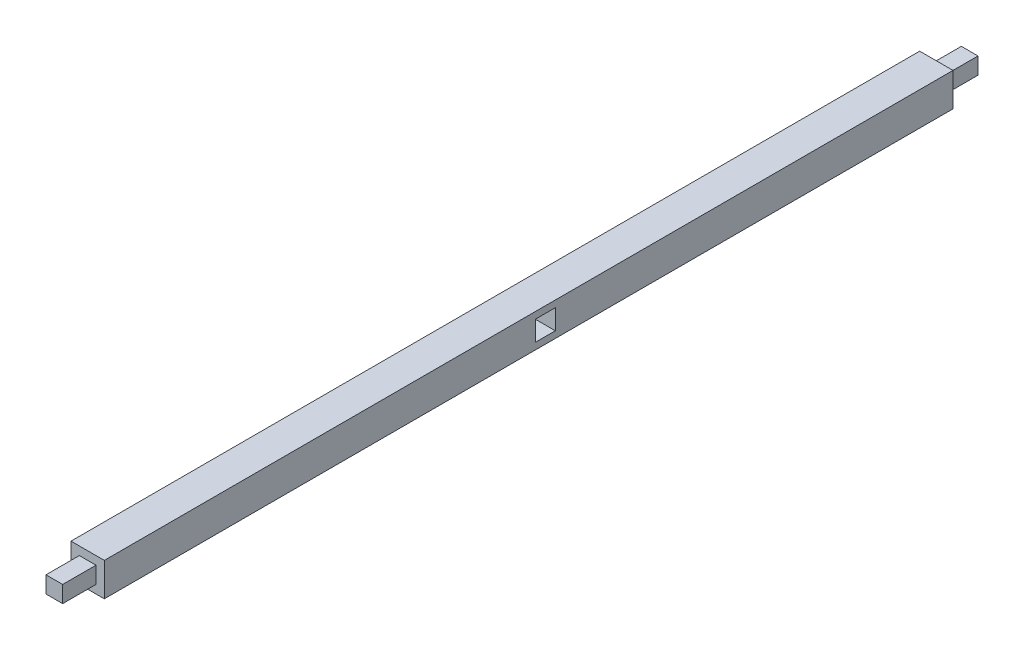
ISO-10303-21;
HEADER;
FILE_DESCRIPTION(('STEP AP214'),'2;1');
FILE_NAME('part.step','',(''),(''),'','','');
FILE_SCHEMA(('AUTOMOTIVE_DESIGN { 1 0 10303 214 1 1 1 1 }'));
ENDSEC;
DATA;
#1=APPLICATION_CONTEXT('core data for automotive mechanical design processes');
#2=APPLICATION_PROTOCOL_DEFINITION('international standard','automotive_design',2000,#1);
#3=PRODUCT_CONTEXT('',#1,'mechanical');
#4=PRODUCT('Part','Part','',(#3));
#5=PRODUCT_RELATED_PRODUCT_CATEGORY('part','',(#4));
#6=PRODUCT_DEFINITION_FORMATION('','',#4);
#7=PRODUCT_DEFINITION_CONTEXT('part definition',#1,'design');
#8=PRODUCT_DEFINITION('design','',#6,#7);
#9=PRODUCT_DEFINITION_SHAPE('','',#8);
#10=(LENGTH_UNIT() NAMED_UNIT(*) SI_UNIT(.MILLI.,.METRE.));
#11=(NAMED_UNIT(*) PLANE_ANGLE_UNIT() SI_UNIT($,.RADIAN.));
#12=(NAMED_UNIT(*) SI_UNIT($,.STERADIAN.) SOLID_ANGLE_UNIT());
#13=UNCERTAINTY_MEASURE_WITH_UNIT(LENGTH_MEASURE(1.E-05),#10,'distance_accuracy_value','');
#14=(GEOMETRIC_REPRESENTATION_CONTEXT(3) GLOBAL_UNCERTAINTY_ASSIGNED_CONTEXT((#13)) GLOBAL_UNIT_ASSIGNED_CONTEXT((#10,
#11,#12)) REPRESENTATION_CONTEXT('',''));
#15=CARTESIAN_POINT('',(0.,0.,0.));
#16=DIRECTION('',(0.,0.,1.));
#17=DIRECTION('',(1.,0.,0.));
#18=AXIS2_PLACEMENT_3D('',#15,#16,#17);
#19=CARTESIAN_POINT('',(0.,0.,127.3));
#20=DIRECTION('',(0.,0.,-1.));
#21=DIRECTION('',(-1.,0.,0.));
#22=AXIS2_PLACEMENT_3D('',#19,#20,#21);
#23=PLANE('',#22);
#24=DIRECTION('',(0.,-1.,0.));
#25=VECTOR('',#24,1.);
#26=CARTESIAN_POINT('',(0.,0.,127.3));
#27=LINE('',#26,#25);
#28=CARTESIAN_POINT('',(0.,5.,127.3));
#29=VERTEX_POINT('',#28);
#30=CARTESIAN_POINT('',(0.,0.,127.3));
#31=VERTEX_POINT('',#30);
#32=EDGE_CURVE('E240',#29,#31,#27,.T.);
#33=ORIENTED_EDGE('',*,*,#32,.T.);
#34=DIRECTION('',(1.,0.,0.));
#35=VECTOR('',#34,1.);
#36=CARTESIAN_POINT('',(0.,0.,127.3));
#37=LINE('',#36,#35);
#38=CARTESIAN_POINT('',(5.,0.,127.3));
#39=VERTEX_POINT('',#38);
#40=EDGE_CURVE('E243',#31,#39,#37,.T.);
#41=ORIENTED_EDGE('',*,*,#40,.T.);
#42=DIRECTION('',(0.,1.,0.));
#43=VECTOR('',#42,1.);
#44=CARTESIAN_POINT('',(5.,0.,127.3));
#45=LINE('',#44,#43);
#46=CARTESIAN_POINT('',(5.,5.,127.3));
#47=VERTEX_POINT('',#46);
#48=EDGE_CURVE('E246',#39,#47,#45,.T.);
#49=ORIENTED_EDGE('',*,*,#48,.T.);
#50=DIRECTION('',(-1.,0.,0.));
#51=VECTOR('',#50,1.);
#52=CARTESIAN_POINT('',(0.,5.,127.3));
#53=LINE('',#52,#51);
#54=EDGE_CURVE('E248',#47,#29,#53,.T.);
#55=ORIENTED_EDGE('',*,*,#54,.T.);
#56=EDGE_LOOP('',(#33,#41,#49,#55));
#57=FACE_BOUND('',#56,.T.);
#58=DIRECTION('',(0.,-1.,0.));
#59=VECTOR('',#58,1.);
#60=CARTESIAN_POINT('',(1.25,1.25,127.3));
#61=LINE('',#60,#59);
#62=CARTESIAN_POINT('',(1.25,3.75,127.3));
#63=VERTEX_POINT('',#62);
#64=CARTESIAN_POINT('',(1.25,1.25,127.3));
#65=VERTEX_POINT('',#64);
#66=EDGE_CURVE('E171',#63,#65,#61,.T.);
#67=ORIENTED_EDGE('',*,*,#66,.F.);
#68=DIRECTION('',(-1.,0.,0.));
#69=VECTOR('',#68,1.);
#70=CARTESIAN_POINT('',(1.25,3.75,127.3));
#71=LINE('',#70,#69);
#72=CARTESIAN_POINT('',(3.75,3.75,127.3));
#73=VERTEX_POINT('',#72);
#74=EDGE_CURVE('E178',#73,#63,#71,.T.);
#75=ORIENTED_EDGE('',*,*,#74,.F.);
#76=DIRECTION('',(0.,1.,0.));
#77=VECTOR('',#76,1.);
#78=CARTESIAN_POINT('',(3.75,1.25,127.3));
#79=LINE('',#78,#77);
#80=CARTESIAN_POINT('',(3.75,1.25,127.3));
#81=VERTEX_POINT('',#80);
#82=EDGE_CURVE('E190',#81,#73,#79,.T.);
#83=ORIENTED_EDGE('',*,*,#82,.F.);
#84=DIRECTION('',(1.,0.,0.));
#85=VECTOR('',#84,1.);
#86=CARTESIAN_POINT('',(1.25,1.25,127.3));
#87=LINE('',#86,#85);
#88=EDGE_CURVE('E187',#65,#81,#87,.T.);
#89=ORIENTED_EDGE('',*,*,#88,.F.);
#90=EDGE_LOOP('',(#67,#75,#83,#89));
#91=FACE_BOUND('',#90,.T.);
#92=ADVANCED_FACE('F33',(#57,#91),#23,.F.);
#93=CARTESIAN_POINT('',(0.,0.,127.3));
#94=DIRECTION('',(1.,0.,0.));
#95=DIRECTION('',(0.,0.,-1.));
#96=AXIS2_PLACEMENT_3D('',#93,#94,#95);
#97=PLANE('',#96);
#98=DIRECTION('',(0.,0.,1.));
#99=VECTOR('',#98,1.);
#100=CARTESIAN_POINT('',(0.,1.,59.65));
#101=LINE('',#100,#99);
#102=CARTESIAN_POINT('',(0.,1.,59.65));
#103=VERTEX_POINT('',#102);
#104=CARTESIAN_POINT('',(0.,1.,62.65));
#105=VERTEX_POINT('',#104);
#106=EDGE_CURVE('E158',#103,#105,#101,.T.);
#107=ORIENTED_EDGE('',*,*,#106,.F.);
#108=DIRECTION('',(0.,-1.,0.));
#109=VECTOR('',#108,1.);
#110=CARTESIAN_POINT('',(0.,1.,59.65));
#111=LINE('',#110,#109);
#112=CARTESIAN_POINT('',(0.,4.,59.65));
#113=VERTEX_POINT('',#112);
#114=EDGE_CURVE('E48',#113,#103,#111,.T.);
#115=ORIENTED_EDGE('',*,*,#114,.F.);
#116=DIRECTION('',(0.,0.,-1.));
#117=VECTOR('',#116,1.);
#118=CARTESIAN_POINT('',(0.,4.,59.65));
#119=LINE('',#118,#117);
#120=CARTESIAN_POINT('',(0.,4.,62.65));
#121=VERTEX_POINT('',#120);
#122=EDGE_CURVE('E164',#121,#113,#119,.T.);
#123=ORIENTED_EDGE('',*,*,#122,.F.);
#124=DIRECTION('',(0.,1.,0.));
#125=VECTOR('',#124,1.);
#126=CARTESIAN_POINT('',(0.,1.,62.65));
#127=LINE('',#126,#125);
#128=EDGE_CURVE('E149',#105,#121,#127,.T.);
#129=ORIENTED_EDGE('',*,*,#128,.F.);
#130=EDGE_LOOP('',(#107,#115,#123,#129));
#131=FACE_BOUND('',#130,.T.);
#132=DIRECTION('',(0.,-1.,0.));
#133=VECTOR('',#132,1.);
#134=CARTESIAN_POINT('',(0.,0.,0.));
#135=LINE('',#134,#133);
#136=CARTESIAN_POINT('',(0.,5.,0.));
#137=VERTEX_POINT('',#136);
#138=CARTESIAN_POINT('',(0.,0.,0.));
#139=VERTEX_POINT('',#138);
#140=EDGE_CURVE('E239',#137,#139,#135,.T.);
#141=ORIENTED_EDGE('',*,*,#140,.T.);
#142=DIRECTION('',(0.,0.,-1.));
#143=VECTOR('',#142,1.);
#144=CARTESIAN_POINT('',(0.,0.,127.3));
#145=LINE('',#144,#143);
#146=EDGE_CURVE('E266',#31,#139,#145,.T.);
#147=ORIENTED_EDGE('',*,*,#146,.F.);
#148=ORIENTED_EDGE('',*,*,#32,.F.);
#149=DIRECTION('',(0.,0.,-1.));
#150=VECTOR('',#149,1.);
#151=CARTESIAN_POINT('',(0.,5.,127.3));
#152=LINE('',#151,#150);
#153=EDGE_CURVE('E250',#29,#137,#152,.T.);
#154=ORIENTED_EDGE('',*,*,#153,.T.);
#155=EDGE_LOOP('',(#141,#147,#148,#154));
#156=FACE_BOUND('',#155,.T.);
#157=ADVANCED_FACE('F35',(#131,#156),#97,.F.);
#158=CARTESIAN_POINT('',(0.,0.,127.3));
#159=DIRECTION('',(0.,1.,0.));
#160=DIRECTION('',(0.,0.,1.));
#161=AXIS2_PLACEMENT_3D('',#158,#159,#160);
#162=PLANE('',#161);
#163=DIRECTION('',(1.,0.,0.));
#164=VECTOR('',#163,1.);
#165=CARTESIAN_POINT('',(0.,0.,0.));
#166=LINE('',#165,#164);
#167=CARTESIAN_POINT('',(5.,0.,0.));
#168=VERTEX_POINT('',#167);
#169=EDGE_CURVE('E253',#139,#168,#166,.T.);
#170=ORIENTED_EDGE('',*,*,#169,.T.);
#171=DIRECTION('',(0.,0.,-1.));
#172=VECTOR('',#171,1.);
#173=CARTESIAN_POINT('',(5.,0.,127.3));
#174=LINE('',#173,#172);
#175=EDGE_CURVE('E263',#39,#168,#174,.T.);
#176=ORIENTED_EDGE('',*,*,#175,.F.);
#177=ORIENTED_EDGE('',*,*,#40,.F.);
#178=ORIENTED_EDGE('',*,*,#146,.T.);
#179=EDGE_LOOP('',(#170,#176,#177,#178));
#180=FACE_BOUND('',#179,.T.);
#181=ADVANCED_FACE('F299',(#180),#162,.F.);
#182=CARTESIAN_POINT('',(5.,0.,127.3));
#183=DIRECTION('',(-1.,0.,0.));
#184=DIRECTION('',(0.,0.,1.));
#185=AXIS2_PLACEMENT_3D('',#182,#183,#184);
#186=PLANE('',#185);
#187=DIRECTION('',(0.,0.,-1.));
#188=VECTOR('',#187,1.);
#189=CARTESIAN_POINT('',(5.,4.,127.3));
#190=LINE('',#189,#188);
#191=CARTESIAN_POINT('',(5.,4.,62.65));
#192=VERTEX_POINT('',#191);
#193=CARTESIAN_POINT('',(5.,4.,59.65));
#194=VERTEX_POINT('',#193);
#195=EDGE_CURVE('E41',#192,#194,#190,.T.);
#196=ORIENTED_EDGE('',*,*,#195,.T.);
#197=DIRECTION('',(0.,-1.,0.));
#198=VECTOR('',#197,1.);
#199=CARTESIAN_POINT('',(5.,0.,59.65));
#200=LINE('',#199,#198);
#201=CARTESIAN_POINT('',(5.,1.,59.65));
#202=VERTEX_POINT('',#201);
#203=EDGE_CURVE('E11',#194,#202,#200,.T.);
#204=ORIENTED_EDGE('',*,*,#203,.T.);
#205=DIRECTION('',(0.,0.,1.));
#206=VECTOR('',#205,1.);
#207=CARTESIAN_POINT('',(5.,1.,127.3));
#208=LINE('',#207,#206);
#209=CARTESIAN_POINT('',(5.,1.,62.65));
#210=VERTEX_POINT('',#209);
#211=EDGE_CURVE('E269',#202,#210,#208,.T.);
#212=ORIENTED_EDGE('',*,*,#211,.T.);
#213=DIRECTION('',(0.,1.,0.));
#214=VECTOR('',#213,1.);
#215=CARTESIAN_POINT('',(5.,0.,62.65));
#216=LINE('',#215,#214);
#217=EDGE_CURVE('E152',#210,#192,#216,.T.);
#218=ORIENTED_EDGE('',*,*,#217,.T.);
#219=EDGE_LOOP('',(#196,#204,#212,#218));
#220=FACE_BOUND('',#219,.T.);
#221=DIRECTION('',(0.,1.,0.));
#222=VECTOR('',#221,1.);
#223=CARTESIAN_POINT('',(5.,0.,0.));
#224=LINE('',#223,#222);
#225=CARTESIAN_POINT('',(5.,5.,0.));
#226=VERTEX_POINT('',#225);
#227=EDGE_CURVE('E255',#168,#226,#224,.T.);
#228=ORIENTED_EDGE('',*,*,#227,.T.);
#229=DIRECTION('',(0.,0.,-1.));
#230=VECTOR('',#229,1.);
#231=CARTESIAN_POINT('',(5.,5.,127.3));
#232=LINE('',#231,#230);
#233=EDGE_CURVE('E260',#47,#226,#232,.T.);
#234=ORIENTED_EDGE('',*,*,#233,.F.);
#235=ORIENTED_EDGE('',*,*,#48,.F.);
#236=ORIENTED_EDGE('',*,*,#175,.T.);
#237=EDGE_LOOP('',(#228,#234,#235,#236));
#238=FACE_BOUND('',#237,.T.);
#239=ADVANCED_FACE('F273',(#220,#238),#186,.F.);
#240=CARTESIAN_POINT('',(0.,5.,127.3));
#241=DIRECTION('',(0.,-1.,0.));
#242=DIRECTION('',(0.,0.,-1.));
#243=AXIS2_PLACEMENT_3D('',#240,#241,#242);
#244=PLANE('',#243);
#245=DIRECTION('',(-1.,0.,0.));
#246=VECTOR('',#245,1.);
#247=CARTESIAN_POINT('',(0.,5.,0.));
#248=LINE('',#247,#246);
#249=EDGE_CURVE('E244',#226,#137,#248,.T.);
#250=ORIENTED_EDGE('',*,*,#249,.T.);
#251=ORIENTED_EDGE('',*,*,#153,.F.);
#252=ORIENTED_EDGE('',*,*,#54,.F.);
#253=ORIENTED_EDGE('',*,*,#233,.T.);
#254=EDGE_LOOP('',(#250,#251,#252,#253));
#255=FACE_BOUND('',#254,.T.);
#256=ADVANCED_FACE('F308',(#255),#244,.F.);
#257=CARTESIAN_POINT('',(0.,0.,0.));
#258=DIRECTION('',(0.,0.,-1.));
#259=DIRECTION('',(-1.,0.,0.));
#260=AXIS2_PLACEMENT_3D('',#257,#258,#259);
#261=PLANE('',#260);
#262=DIRECTION('',(0.,-1.,0.));
#263=VECTOR('',#262,1.);
#264=CARTESIAN_POINT('',(3.75,1.25,0.));
#265=LINE('',#264,#263);
#266=CARTESIAN_POINT('',(3.75,3.75,0.));
#267=VERTEX_POINT('',#266);
#268=CARTESIAN_POINT('',(3.75,1.25,0.));
#269=VERTEX_POINT('',#268);
#270=EDGE_CURVE('E206',#267,#269,#265,.T.);
#271=ORIENTED_EDGE('',*,*,#270,.F.);
#272=DIRECTION('',(1.,0.,0.));
#273=VECTOR('',#272,1.);
#274=CARTESIAN_POINT('',(3.75,3.75,0.));
#275=LINE('',#274,#273);
#276=CARTESIAN_POINT('',(1.25,3.75,0.));
#277=VERTEX_POINT('',#276);
#278=EDGE_CURVE('E211',#277,#267,#275,.T.);
#279=ORIENTED_EDGE('',*,*,#278,.F.);
#280=DIRECTION('',(0.,1.,0.));
#281=VECTOR('',#280,1.);
#282=CARTESIAN_POINT('',(1.25,1.25,0.));
#283=LINE('',#282,#281);
#284=CARTESIAN_POINT('',(1.25,1.25,0.));
#285=VERTEX_POINT('',#284);
#286=EDGE_CURVE('E223',#285,#277,#283,.T.);
#287=ORIENTED_EDGE('',*,*,#286,.F.);
#288=DIRECTION('',(-1.,0.,0.));
#289=VECTOR('',#288,1.);
#290=CARTESIAN_POINT('',(3.75,1.25,0.));
#291=LINE('',#290,#289);
#292=EDGE_CURVE('E220',#269,#285,#291,.T.);
#293=ORIENTED_EDGE('',*,*,#292,.F.);
#294=EDGE_LOOP('',(#271,#279,#287,#293));
#295=FACE_BOUND('',#294,.T.);
#296=ORIENTED_EDGE('',*,*,#140,.F.);
#297=ORIENTED_EDGE('',*,*,#249,.F.);
#298=ORIENTED_EDGE('',*,*,#227,.F.);
#299=ORIENTED_EDGE('',*,*,#169,.F.);
#300=EDGE_LOOP('',(#296,#297,#298,#299));
#301=FACE_BOUND('',#300,.T.);
#302=ADVANCED_FACE('F305',(#295,#301),#261,.T.);
#303=CARTESIAN_POINT('',(3.75,1.25,-5.));
#304=DIRECTION('',(-1.,0.,0.));
#305=DIRECTION('',(0.,0.,1.));
#306=AXIS2_PLACEMENT_3D('',#303,#304,#305);
#307=PLANE('',#306);
#308=ORIENTED_EDGE('',*,*,#270,.T.);
#309=DIRECTION('',(0.,0.,1.));
#310=VECTOR('',#309,1.);
#311=CARTESIAN_POINT('',(3.75,1.25,-5.));
#312=LINE('',#311,#310);
#313=CARTESIAN_POINT('',(3.75,1.25,-5.));
#314=VERTEX_POINT('',#313);
#315=EDGE_CURVE('E236',#314,#269,#312,.T.);
#316=ORIENTED_EDGE('',*,*,#315,.F.);
#317=DIRECTION('',(0.,-1.,0.));
#318=VECTOR('',#317,1.);
#319=CARTESIAN_POINT('',(3.75,1.25,-5.));
#320=LINE('',#319,#318);
#321=CARTESIAN_POINT('',(3.75,3.75,-5.));
#322=VERTEX_POINT('',#321);
#323=EDGE_CURVE('E207',#322,#314,#320,.T.);
#324=ORIENTED_EDGE('',*,*,#323,.F.);
#325=DIRECTION('',(0.,0.,1.));
#326=VECTOR('',#325,1.);
#327=CARTESIAN_POINT('',(3.75,3.75,-5.));
#328=LINE('',#327,#326);
#329=EDGE_CURVE('E217',#322,#267,#328,.T.);
#330=ORIENTED_EDGE('',*,*,#329,.T.);
#331=EDGE_LOOP('',(#308,#316,#324,#330));
#332=FACE_BOUND('',#331,.T.);
#333=ADVANCED_FACE('F303',(#332),#307,.F.);
#334=CARTESIAN_POINT('',(3.75,1.25,-5.));
#335=DIRECTION('',(0.,1.,0.));
#336=DIRECTION('',(0.,0.,1.));
#337=AXIS2_PLACEMENT_3D('',#334,#335,#336);
#338=PLANE('',#337);
#339=ORIENTED_EDGE('',*,*,#292,.T.);
#340=DIRECTION('',(0.,0.,1.));
#341=VECTOR('',#340,1.);
#342=CARTESIAN_POINT('',(1.25,1.25,-5.));
#343=LINE('',#342,#341);
#344=CARTESIAN_POINT('',(1.25,1.25,-5.));
#345=VERTEX_POINT('',#344);
#346=EDGE_CURVE('E233',#345,#285,#343,.T.);
#347=ORIENTED_EDGE('',*,*,#346,.F.);
#348=DIRECTION('',(-1.,0.,0.));
#349=VECTOR('',#348,1.);
#350=CARTESIAN_POINT('',(3.75,1.25,-5.));
#351=LINE('',#350,#349);
#352=EDGE_CURVE('E210',#314,#345,#351,.T.);
#353=ORIENTED_EDGE('',*,*,#352,.F.);
#354=ORIENTED_EDGE('',*,*,#315,.T.);
#355=EDGE_LOOP('',(#339,#347,#353,#354));
#356=FACE_BOUND('',#355,.T.);
#357=ADVANCED_FACE('F361',(#356),#338,.F.);
#358=CARTESIAN_POINT('',(1.25,1.25,-5.));
#359=DIRECTION('',(1.,0.,0.));
#360=DIRECTION('',(0.,0.,-1.));
#361=AXIS2_PLACEMENT_3D('',#358,#359,#360);
#362=PLANE('',#361);
#363=ORIENTED_EDGE('',*,*,#286,.T.);
#364=DIRECTION('',(0.,0.,1.));
#365=VECTOR('',#364,1.);
#366=CARTESIAN_POINT('',(1.25,3.75,-5.));
#367=LINE('',#366,#365);
#368=CARTESIAN_POINT('',(1.25,3.75,-5.));
#369=VERTEX_POINT('',#368);
#370=EDGE_CURVE('E230',#369,#277,#367,.T.);
#371=ORIENTED_EDGE('',*,*,#370,.F.);
#372=DIRECTION('',(0.,1.,0.));
#373=VECTOR('',#372,1.);
#374=CARTESIAN_POINT('',(1.25,1.25,-5.));
#375=LINE('',#374,#373);
#376=EDGE_CURVE('E213',#345,#369,#375,.T.);
#377=ORIENTED_EDGE('',*,*,#376,.F.);
#378=ORIENTED_EDGE('',*,*,#346,.T.);
#379=EDGE_LOOP('',(#363,#371,#377,#378));
#380=FACE_BOUND('',#379,.T.);
#381=ADVANCED_FACE('F367',(#380),#362,.F.);
#382=CARTESIAN_POINT('',(3.75,3.75,-5.));
#383=DIRECTION('',(0.,-1.,0.));
#384=DIRECTION('',(0.,0.,-1.));
#385=AXIS2_PLACEMENT_3D('',#382,#383,#384);
#386=PLANE('',#385);
#387=ORIENTED_EDGE('',*,*,#278,.T.);
#388=ORIENTED_EDGE('',*,*,#329,.F.);
#389=DIRECTION('',(1.,0.,0.));
#390=VECTOR('',#389,1.);
#391=CARTESIAN_POINT('',(3.75,3.75,-5.));
#392=LINE('',#391,#390);
#393=EDGE_CURVE('E215',#369,#322,#392,.T.);
#394=ORIENTED_EDGE('',*,*,#393,.F.);
#395=ORIENTED_EDGE('',*,*,#370,.T.);
#396=EDGE_LOOP('',(#387,#388,#394,#395));
#397=FACE_BOUND('',#396,.T.);
#398=ADVANCED_FACE('F374',(#397),#386,.F.);
#399=CARTESIAN_POINT('',(0.,0.,-5.));
#400=DIRECTION('',(0.,0.,1.));
#401=DIRECTION('',(1.,0.,0.));
#402=AXIS2_PLACEMENT_3D('',#399,#400,#401);
#403=PLANE('',#402);
#404=ORIENTED_EDGE('',*,*,#323,.T.);
#405=ORIENTED_EDGE('',*,*,#352,.T.);
#406=ORIENTED_EDGE('',*,*,#376,.T.);
#407=ORIENTED_EDGE('',*,*,#393,.T.);
#408=EDGE_LOOP('',(#404,#405,#406,#407));
#409=FACE_BOUND('',#408,.T.);
#410=ADVANCED_FACE('F382',(#409),#403,.F.);
#411=CARTESIAN_POINT('',(1.25,1.25,132.3));
#412=DIRECTION('',(1.,0.,0.));
#413=DIRECTION('',(0.,0.,-1.));
#414=AXIS2_PLACEMENT_3D('',#411,#412,#413);
#415=PLANE('',#414);
#416=ORIENTED_EDGE('',*,*,#66,.T.);
#417=DIRECTION('',(0.,0.,-1.));
#418=VECTOR('',#417,1.);
#419=CARTESIAN_POINT('',(1.25,1.25,132.3));
#420=LINE('',#419,#418);
#421=CARTESIAN_POINT('',(1.25,1.25,132.3));
#422=VERTEX_POINT('',#421);
#423=EDGE_CURVE('E203',#422,#65,#420,.T.);
#424=ORIENTED_EDGE('',*,*,#423,.F.);
#425=DIRECTION('',(0.,-1.,0.));
#426=VECTOR('',#425,1.);
#427=CARTESIAN_POINT('',(1.25,1.25,132.3));
#428=LINE('',#427,#426);
#429=CARTESIAN_POINT('',(1.25,3.75,132.3));
#430=VERTEX_POINT('',#429);
#431=EDGE_CURVE('E174',#430,#422,#428,.T.);
#432=ORIENTED_EDGE('',*,*,#431,.F.);
#433=DIRECTION('',(0.,0.,-1.));
#434=VECTOR('',#433,1.);
#435=CARTESIAN_POINT('',(1.25,3.75,132.3));
#436=LINE('',#435,#434);
#437=EDGE_CURVE('E184',#430,#63,#436,.T.);
#438=ORIENTED_EDGE('',*,*,#437,.T.);
#439=EDGE_LOOP('',(#416,#424,#432,#438));
#440=FACE_BOUND('',#439,.T.);
#441=ADVANCED_FACE('F389',(#440),#415,.F.);
#442=CARTESIAN_POINT('',(1.25,1.25,132.3));
#443=DIRECTION('',(0.,1.,0.));
#444=DIRECTION('',(0.,0.,1.));
#445=AXIS2_PLACEMENT_3D('',#442,#443,#444);
#446=PLANE('',#445);
#447=ORIENTED_EDGE('',*,*,#88,.T.);
#448=DIRECTION('',(0.,0.,-1.));
#449=VECTOR('',#448,1.);
#450=CARTESIAN_POINT('',(3.75,1.25,132.3));
#451=LINE('',#450,#449);
#452=CARTESIAN_POINT('',(3.75,1.25,132.3));
#453=VERTEX_POINT('',#452);
#454=EDGE_CURVE('E200',#453,#81,#451,.T.);
#455=ORIENTED_EDGE('',*,*,#454,.F.);
#456=DIRECTION('',(1.,0.,0.));
#457=VECTOR('',#456,1.);
#458=CARTESIAN_POINT('',(1.25,1.25,132.3));
#459=LINE('',#458,#457);
#460=EDGE_CURVE('E177',#422,#453,#459,.T.);
#461=ORIENTED_EDGE('',*,*,#460,.F.);
#462=ORIENTED_EDGE('',*,*,#423,.T.);
#463=EDGE_LOOP('',(#447,#455,#461,#462));
#464=FACE_BOUND('',#463,.T.);
#465=ADVANCED_FACE('F395',(#464),#446,.F.);
#466=CARTESIAN_POINT('',(3.75,1.25,132.3));
#467=DIRECTION('',(-1.,0.,0.));
#468=DIRECTION('',(0.,0.,1.));
#469=AXIS2_PLACEMENT_3D('',#466,#467,#468);
#470=PLANE('',#469);
#471=ORIENTED_EDGE('',*,*,#82,.T.);
#472=DIRECTION('',(0.,0.,-1.));
#473=VECTOR('',#472,1.);
#474=CARTESIAN_POINT('',(3.75,3.75,132.3));
#475=LINE('',#474,#473);
#476=CARTESIAN_POINT('',(3.75,3.75,132.3));
#477=VERTEX_POINT('',#476);
#478=EDGE_CURVE('E197',#477,#73,#475,.T.);
#479=ORIENTED_EDGE('',*,*,#478,.F.);
#480=DIRECTION('',(0.,1.,0.));
#481=VECTOR('',#480,1.);
#482=CARTESIAN_POINT('',(3.75,1.25,132.3));
#483=LINE('',#482,#481);
#484=EDGE_CURVE('E180',#453,#477,#483,.T.);
#485=ORIENTED_EDGE('',*,*,#484,.F.);
#486=ORIENTED_EDGE('',*,*,#454,.T.);
#487=EDGE_LOOP('',(#471,#479,#485,#486));
#488=FACE_BOUND('',#487,.T.);
#489=ADVANCED_FACE('F402',(#488),#470,.F.);
#490=CARTESIAN_POINT('',(1.25,3.75,132.3));
#491=DIRECTION('',(0.,-1.,0.));
#492=DIRECTION('',(0.,0.,-1.));
#493=AXIS2_PLACEMENT_3D('',#490,#491,#492);
#494=PLANE('',#493);
#495=ORIENTED_EDGE('',*,*,#74,.T.);
#496=ORIENTED_EDGE('',*,*,#437,.F.);
#497=DIRECTION('',(-1.,0.,0.));
#498=VECTOR('',#497,1.);
#499=CARTESIAN_POINT('',(1.25,3.75,132.3));
#500=LINE('',#499,#498);
#501=EDGE_CURVE('E182',#477,#430,#500,.T.);
#502=ORIENTED_EDGE('',*,*,#501,.F.);
#503=ORIENTED_EDGE('',*,*,#478,.T.);
#504=EDGE_LOOP('',(#495,#496,#502,#503));
#505=FACE_BOUND('',#504,.T.);
#506=ADVANCED_FACE('F287',(#505),#494,.F.);
#507=CARTESIAN_POINT('',(0.,0.,132.3));
#508=DIRECTION('',(0.,0.,-1.));
#509=DIRECTION('',(-1.,0.,0.));
#510=AXIS2_PLACEMENT_3D('',#507,#508,#509);
#511=PLANE('',#510);
#512=ORIENTED_EDGE('',*,*,#431,.T.);
#513=ORIENTED_EDGE('',*,*,#460,.T.);
#514=ORIENTED_EDGE('',*,*,#484,.T.);
#515=ORIENTED_EDGE('',*,*,#501,.T.);
#516=EDGE_LOOP('',(#512,#513,#514,#515));
#517=FACE_BOUND('',#516,.T.);
#518=ADVANCED_FACE('F280',(#517),#511,.F.);
#519=CARTESIAN_POINT('',(30.,1.,59.65));
#520=DIRECTION('',(0.,0.,-1.));
#521=DIRECTION('',(-1.,0.,0.));
#522=AXIS2_PLACEMENT_3D('',#519,#520,#521);
#523=PLANE('',#522);
#524=DIRECTION('',(-1.,0.,0.));
#525=VECTOR('',#524,1.);
#526=CARTESIAN_POINT('',(30.,4.,59.65));
#527=LINE('',#526,#525);
#528=EDGE_CURVE('E169',#194,#113,#527,.T.);
#529=ORIENTED_EDGE('',*,*,#528,.T.);
#530=ORIENTED_EDGE('',*,*,#114,.T.);
#531=DIRECTION('',(-1.,0.,0.));
#532=VECTOR('',#531,1.);
#533=CARTESIAN_POINT('',(30.,1.,59.65));
#534=LINE('',#533,#532);
#535=EDGE_CURVE('E155',#202,#103,#534,.T.);
#536=ORIENTED_EDGE('',*,*,#535,.F.);
#537=ORIENTED_EDGE('',*,*,#203,.F.);
#538=EDGE_LOOP('',(#529,#530,#536,#537));
#539=FACE_BOUND('',#538,.T.);
#540=ADVANCED_FACE('F278',(#539),#523,.F.);
#541=CARTESIAN_POINT('',(30.,4.,59.65));
#542=DIRECTION('',(0.,1.,0.));
#543=DIRECTION('',(0.,0.,1.));
#544=AXIS2_PLACEMENT_3D('',#541,#542,#543);
#545=PLANE('',#544);
#546=DIRECTION('',(-1.,0.,0.));
#547=VECTOR('',#546,1.);
#548=CARTESIAN_POINT('',(30.,4.,62.65));
#549=LINE('',#548,#547);
#550=EDGE_CURVE('E154',#192,#121,#549,.T.);
#551=ORIENTED_EDGE('',*,*,#550,.T.);
#552=ORIENTED_EDGE('',*,*,#122,.T.);
#553=ORIENTED_EDGE('',*,*,#528,.F.);
#554=ORIENTED_EDGE('',*,*,#195,.F.);
#555=EDGE_LOOP('',(#551,#552,#553,#554));
#556=FACE_BOUND('',#555,.T.);
#557=ADVANCED_FACE('F277',(#556),#545,.F.);
#558=CARTESIAN_POINT('',(30.,1.,62.65));
#559=DIRECTION('',(0.,0.,1.));
#560=DIRECTION('',(1.,0.,0.));
#561=AXIS2_PLACEMENT_3D('',#558,#559,#560);
#562=PLANE('',#561);
#563=DIRECTION('',(-1.,0.,0.));
#564=VECTOR('',#563,1.);
#565=CARTESIAN_POINT('',(30.,1.,62.65));
#566=LINE('',#565,#564);
#567=EDGE_CURVE('E56',#210,#105,#566,.T.);
#568=ORIENTED_EDGE('',*,*,#567,.T.);
#569=ORIENTED_EDGE('',*,*,#128,.T.);
#570=ORIENTED_EDGE('',*,*,#550,.F.);
#571=ORIENTED_EDGE('',*,*,#217,.F.);
#572=EDGE_LOOP('',(#568,#569,#570,#571));
#573=FACE_BOUND('',#572,.T.);
#574=ADVANCED_FACE('F146',(#573),#562,.F.);
#575=CARTESIAN_POINT('',(30.,1.,59.65));
#576=DIRECTION('',(0.,-1.,0.));
#577=DIRECTION('',(0.,0.,-1.));
#578=AXIS2_PLACEMENT_3D('',#575,#576,#577);
#579=PLANE('',#578);
#580=ORIENTED_EDGE('',*,*,#535,.T.);
#581=ORIENTED_EDGE('',*,*,#106,.T.);
#582=ORIENTED_EDGE('',*,*,#567,.F.);
#583=ORIENTED_EDGE('',*,*,#211,.F.);
#584=EDGE_LOOP('',(#580,#581,#582,#583));
#585=FACE_BOUND('',#584,.T.);
#586=ADVANCED_FACE('F159',(#585),#579,.F.);
#587=CLOSED_SHELL('',(#92,#157,#181,#239,#256,#302,#333,#357,#381,#398,#410,#441,#465,#489,#506,
#518,#540,#557,#574,#586));
#588=MANIFOLD_SOLID_BREP('B2',#587);
#589=ADVANCED_BREP_SHAPE_REPRESENTATION('',(#18,#588),#14);
#590=SHAPE_DEFINITION_REPRESENTATION(#9,#589);
ENDSEC;
END-ISO-10303-21;
